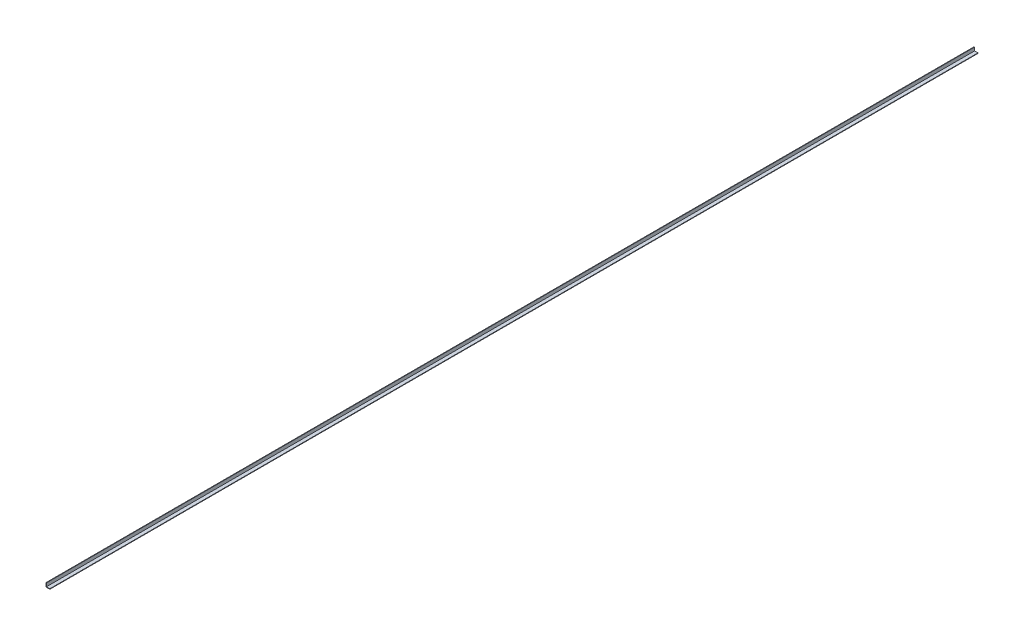
ISO-10303-21;
HEADER;
FILE_DESCRIPTION(('STEP AP214'),'2;1');
FILE_NAME('part.step','',(''),(''),'','','');
FILE_SCHEMA(('AUTOMOTIVE_DESIGN { 1 0 10303 214 1 1 1 1 }'));
ENDSEC;
DATA;
#1=APPLICATION_CONTEXT('core data for automotive mechanical design processes');
#2=APPLICATION_PROTOCOL_DEFINITION('international standard','automotive_design',2000,#1);
#3=PRODUCT_CONTEXT('',#1,'mechanical');
#4=PRODUCT('Part','Part','',(#3));
#5=PRODUCT_RELATED_PRODUCT_CATEGORY('part','',(#4));
#6=PRODUCT_DEFINITION_FORMATION('','',#4);
#7=PRODUCT_DEFINITION_CONTEXT('part definition',#1,'design');
#8=PRODUCT_DEFINITION('design','',#6,#7);
#9=PRODUCT_DEFINITION_SHAPE('','',#8);
#10=(LENGTH_UNIT() NAMED_UNIT(*) SI_UNIT(.MILLI.,.METRE.));
#11=(NAMED_UNIT(*) PLANE_ANGLE_UNIT() SI_UNIT($,.RADIAN.));
#12=(NAMED_UNIT(*) SI_UNIT($,.STERADIAN.) SOLID_ANGLE_UNIT());
#13=UNCERTAINTY_MEASURE_WITH_UNIT(LENGTH_MEASURE(1.E-05),#10,'distance_accuracy_value','');
#14=(GEOMETRIC_REPRESENTATION_CONTEXT(3) GLOBAL_UNCERTAINTY_ASSIGNED_CONTEXT((#13)) GLOBAL_UNIT_ASSIGNED_CONTEXT((#10,
#11,#12)) REPRESENTATION_CONTEXT('',''));
#15=CARTESIAN_POINT('',(0.,0.,0.));
#16=DIRECTION('',(0.,0.,1.));
#17=DIRECTION('',(1.,0.,0.));
#18=AXIS2_PLACEMENT_3D('',#15,#16,#17);
#19=CARTESIAN_POINT('',(3.18,25.4,-6100.));
#20=DIRECTION('',(0.,1.,0.));
#21=DIRECTION('',(0.,0.,1.));
#22=AXIS2_PLACEMENT_3D('',#19,#20,#21);
#23=PLANE('',#22);
#24=DIRECTION('',(-1.,0.,0.));
#25=VECTOR('',#24,1.);
#26=CARTESIAN_POINT('',(3.18,25.4,0.));
#27=LINE('',#26,#25);
#28=CARTESIAN_POINT('',(3.18,25.4,0.));
#29=VERTEX_POINT('',#28);
#30=CARTESIAN_POINT('',(0.,25.4,0.));
#31=VERTEX_POINT('',#30);
#32=EDGE_CURVE('E118',#29,#31,#27,.T.);
#33=ORIENTED_EDGE('',*,*,#32,.F.);
#34=DIRECTION('',(0.,0.,1.));
#35=VECTOR('',#34,1.);
#36=CARTESIAN_POINT('',(3.18,25.4,-6100.));
#37=LINE('',#36,#35);
#38=CARTESIAN_POINT('',(3.18,25.4,-6100.));
#39=VERTEX_POINT('',#38);
#40=EDGE_CURVE('E11',#39,#29,#37,.T.);
#41=ORIENTED_EDGE('',*,*,#40,.F.);
#42=DIRECTION('',(-1.,0.,0.));
#43=VECTOR('',#42,1.);
#44=CARTESIAN_POINT('',(3.18,25.4,-6100.));
#45=LINE('',#44,#43);
#46=CARTESIAN_POINT('',(0.,25.4,-6100.));
#47=VERTEX_POINT('',#46);
#48=EDGE_CURVE('E132',#39,#47,#45,.T.);
#49=ORIENTED_EDGE('',*,*,#48,.T.);
#50=DIRECTION('',(0.,0.,1.));
#51=VECTOR('',#50,1.);
#52=CARTESIAN_POINT('',(0.,25.4,-6100.));
#53=LINE('',#52,#51);
#54=EDGE_CURVE('E36',#47,#31,#53,.T.);
#55=ORIENTED_EDGE('',*,*,#54,.T.);
#56=EDGE_LOOP('',(#33,#41,#49,#55));
#57=FACE_BOUND('',#56,.T.);
#58=ADVANCED_FACE('F33',(#57),#23,.T.);
#59=CARTESIAN_POINT('',(3.18,3.18,-6100.));
#60=DIRECTION('',(1.,0.,0.));
#61=DIRECTION('',(0.,1.,0.));
#62=AXIS2_PLACEMENT_3D('',#59,#60,#61);
#63=PLANE('',#62);
#64=DIRECTION('',(0.,1.,0.));
#65=VECTOR('',#64,1.);
#66=CARTESIAN_POINT('',(3.18,3.18,0.));
#67=LINE('',#66,#65);
#68=CARTESIAN_POINT('',(3.18,3.18,0.));
#69=VERTEX_POINT('',#68);
#70=EDGE_CURVE('E130',#69,#29,#67,.T.);
#71=ORIENTED_EDGE('',*,*,#70,.F.);
#72=DIRECTION('',(0.,0.,1.));
#73=VECTOR('',#72,1.);
#74=CARTESIAN_POINT('',(3.18,3.18,-6100.));
#75=LINE('',#74,#73);
#76=CARTESIAN_POINT('',(3.18,3.18,-6100.));
#77=VERTEX_POINT('',#76);
#78=EDGE_CURVE('E42',#77,#69,#75,.T.);
#79=ORIENTED_EDGE('',*,*,#78,.F.);
#80=DIRECTION('',(0.,1.,0.));
#81=VECTOR('',#80,1.);
#82=CARTESIAN_POINT('',(3.18,3.18,-6100.));
#83=LINE('',#82,#81);
#84=EDGE_CURVE('E108',#77,#39,#83,.T.);
#85=ORIENTED_EDGE('',*,*,#84,.T.);
#86=ORIENTED_EDGE('',*,*,#40,.T.);
#87=EDGE_LOOP('',(#71,#79,#85,#86));
#88=FACE_BOUND('',#87,.T.);
#89=ADVANCED_FACE('F140',(#88),#63,.T.);
#90=CARTESIAN_POINT('',(25.4,3.18,-6100.));
#91=DIRECTION('',(0.,1.,0.));
#92=DIRECTION('',(-1.,0.,0.));
#93=AXIS2_PLACEMENT_3D('',#90,#91,#92);
#94=PLANE('',#93);
#95=DIRECTION('',(-1.,0.,0.));
#96=VECTOR('',#95,1.);
#97=CARTESIAN_POINT('',(25.4,3.18,0.));
#98=LINE('',#97,#96);
#99=CARTESIAN_POINT('',(25.4,3.18,0.));
#100=VERTEX_POINT('',#99);
#101=EDGE_CURVE('E95',#100,#69,#98,.T.);
#102=ORIENTED_EDGE('',*,*,#101,.F.);
#103=DIRECTION('',(0.,0.,1.));
#104=VECTOR('',#103,1.);
#105=CARTESIAN_POINT('',(25.4,3.18,-6100.));
#106=LINE('',#105,#104);
#107=CARTESIAN_POINT('',(25.4,3.18,-6100.));
#108=VERTEX_POINT('',#107);
#109=EDGE_CURVE('E90',#108,#100,#106,.T.);
#110=ORIENTED_EDGE('',*,*,#109,.F.);
#111=DIRECTION('',(-1.,0.,0.));
#112=VECTOR('',#111,1.);
#113=CARTESIAN_POINT('',(25.4,3.18,-6100.));
#114=LINE('',#113,#112);
#115=EDGE_CURVE('E93',#108,#77,#114,.T.);
#116=ORIENTED_EDGE('',*,*,#115,.T.);
#117=ORIENTED_EDGE('',*,*,#78,.T.);
#118=EDGE_LOOP('',(#102,#110,#116,#117));
#119=FACE_BOUND('',#118,.T.);
#120=ADVANCED_FACE('F92',(#119),#94,.T.);
#121=CARTESIAN_POINT('',(25.4,0.,-6100.));
#122=DIRECTION('',(1.,0.,0.));
#123=DIRECTION('',(0.,0.,-1.));
#124=AXIS2_PLACEMENT_3D('',#121,#122,#123);
#125=PLANE('',#124);
#126=DIRECTION('',(0.,1.,0.));
#127=VECTOR('',#126,1.);
#128=CARTESIAN_POINT('',(25.4,0.,0.));
#129=LINE('',#128,#127);
#130=CARTESIAN_POINT('',(25.4,0.,0.));
#131=VERTEX_POINT('',#130);
#132=EDGE_CURVE('E127',#131,#100,#129,.T.);
#133=ORIENTED_EDGE('',*,*,#132,.F.);
#134=DIRECTION('',(0.,0.,1.));
#135=VECTOR('',#134,1.);
#136=CARTESIAN_POINT('',(25.4,0.,-6100.));
#137=LINE('',#136,#135);
#138=CARTESIAN_POINT('',(25.4,0.,-6100.));
#139=VERTEX_POINT('',#138);
#140=EDGE_CURVE('E100',#139,#131,#137,.T.);
#141=ORIENTED_EDGE('',*,*,#140,.F.);
#142=DIRECTION('',(0.,1.,0.));
#143=VECTOR('',#142,1.);
#144=CARTESIAN_POINT('',(25.4,0.,-6100.));
#145=LINE('',#144,#143);
#146=EDGE_CURVE('E106',#139,#108,#145,.T.);
#147=ORIENTED_EDGE('',*,*,#146,.T.);
#148=ORIENTED_EDGE('',*,*,#109,.T.);
#149=EDGE_LOOP('',(#133,#141,#147,#148));
#150=FACE_BOUND('',#149,.T.);
#151=ADVANCED_FACE('F110',(#150),#125,.T.);
#152=CARTESIAN_POINT('',(0.,0.,-6100.));
#153=DIRECTION('',(0.,-1.,0.));
#154=DIRECTION('',(0.,0.,-1.));
#155=AXIS2_PLACEMENT_3D('',#152,#153,#154);
#156=PLANE('',#155);
#157=DIRECTION('',(1.,0.,0.));
#158=VECTOR('',#157,1.);
#159=CARTESIAN_POINT('',(0.,0.,0.));
#160=LINE('',#159,#158);
#161=CARTESIAN_POINT('',(0.,0.,0.));
#162=VERTEX_POINT('',#161);
#163=EDGE_CURVE('E124',#162,#131,#160,.T.);
#164=ORIENTED_EDGE('',*,*,#163,.F.);
#165=DIRECTION('',(0.,0.,1.));
#166=VECTOR('',#165,1.);
#167=CARTESIAN_POINT('',(0.,0.,-6100.));
#168=LINE('',#167,#166);
#169=CARTESIAN_POINT('',(0.,0.,-6100.));
#170=VERTEX_POINT('',#169);
#171=EDGE_CURVE('E135',#170,#162,#168,.T.);
#172=ORIENTED_EDGE('',*,*,#171,.F.);
#173=DIRECTION('',(1.,0.,0.));
#174=VECTOR('',#173,1.);
#175=CARTESIAN_POINT('',(0.,0.,-6100.));
#176=LINE('',#175,#174);
#177=EDGE_CURVE('E111',#170,#139,#176,.T.);
#178=ORIENTED_EDGE('',*,*,#177,.T.);
#179=ORIENTED_EDGE('',*,*,#140,.T.);
#180=EDGE_LOOP('',(#164,#172,#178,#179));
#181=FACE_BOUND('',#180,.T.);
#182=ADVANCED_FACE('F153',(#181),#156,.T.);
#183=CARTESIAN_POINT('',(0.,25.4,-6100.));
#184=DIRECTION('',(-1.,0.,0.));
#185=DIRECTION('',(0.,-1.,0.));
#186=AXIS2_PLACEMENT_3D('',#183,#184,#185);
#187=PLANE('',#186);
#188=DIRECTION('',(0.,-1.,0.));
#189=VECTOR('',#188,1.);
#190=CARTESIAN_POINT('',(0.,25.4,0.));
#191=LINE('',#190,#189);
#192=EDGE_CURVE('E121',#31,#162,#191,.T.);
#193=ORIENTED_EDGE('',*,*,#192,.F.);
#194=ORIENTED_EDGE('',*,*,#54,.F.);
#195=DIRECTION('',(0.,-1.,0.));
#196=VECTOR('',#195,1.);
#197=CARTESIAN_POINT('',(0.,25.4,-6100.));
#198=LINE('',#197,#196);
#199=EDGE_CURVE('E113',#47,#170,#198,.T.);
#200=ORIENTED_EDGE('',*,*,#199,.T.);
#201=ORIENTED_EDGE('',*,*,#171,.T.);
#202=EDGE_LOOP('',(#193,#194,#200,#201));
#203=FACE_BOUND('',#202,.T.);
#204=ADVANCED_FACE('F137',(#203),#187,.T.);
#205=CARTESIAN_POINT('',(0.,0.,-6100.));
#206=DIRECTION('',(0.,0.,1.));
#207=DIRECTION('',(1.,0.,0.));
#208=AXIS2_PLACEMENT_3D('',#205,#206,#207);
#209=PLANE('',#208);
#210=ORIENTED_EDGE('',*,*,#48,.F.);
#211=ORIENTED_EDGE('',*,*,#84,.F.);
#212=ORIENTED_EDGE('',*,*,#115,.F.);
#213=ORIENTED_EDGE('',*,*,#146,.F.);
#214=ORIENTED_EDGE('',*,*,#177,.F.);
#215=ORIENTED_EDGE('',*,*,#199,.F.);
#216=EDGE_LOOP('',(#210,#211,#212,#213,#214,#215));
#217=FACE_BOUND('',#216,.T.);
#218=ADVANCED_FACE('F104',(#217),#209,.F.);
#219=CARTESIAN_POINT('',(0.,0.,0.));
#220=DIRECTION('',(0.,0.,1.));
#221=DIRECTION('',(1.,0.,0.));
#222=AXIS2_PLACEMENT_3D('',#219,#220,#221);
#223=PLANE('',#222);
#224=ORIENTED_EDGE('',*,*,#32,.T.);
#225=ORIENTED_EDGE('',*,*,#192,.T.);
#226=ORIENTED_EDGE('',*,*,#163,.T.);
#227=ORIENTED_EDGE('',*,*,#132,.T.);
#228=ORIENTED_EDGE('',*,*,#101,.T.);
#229=ORIENTED_EDGE('',*,*,#70,.T.);
#230=EDGE_LOOP('',(#224,#225,#226,#227,#228,#229));
#231=FACE_BOUND('',#230,.T.);
#232=ADVANCED_FACE('F139',(#231),#223,.T.);
#233=CLOSED_SHELL('',(#58,#89,#120,#151,#182,#204,#218,#232));
#234=MANIFOLD_SOLID_BREP('B2',#233);
#235=ADVANCED_BREP_SHAPE_REPRESENTATION('',(#18,#234),#14);
#236=SHAPE_DEFINITION_REPRESENTATION(#9,#235);
ENDSEC;
END-ISO-10303-21;
